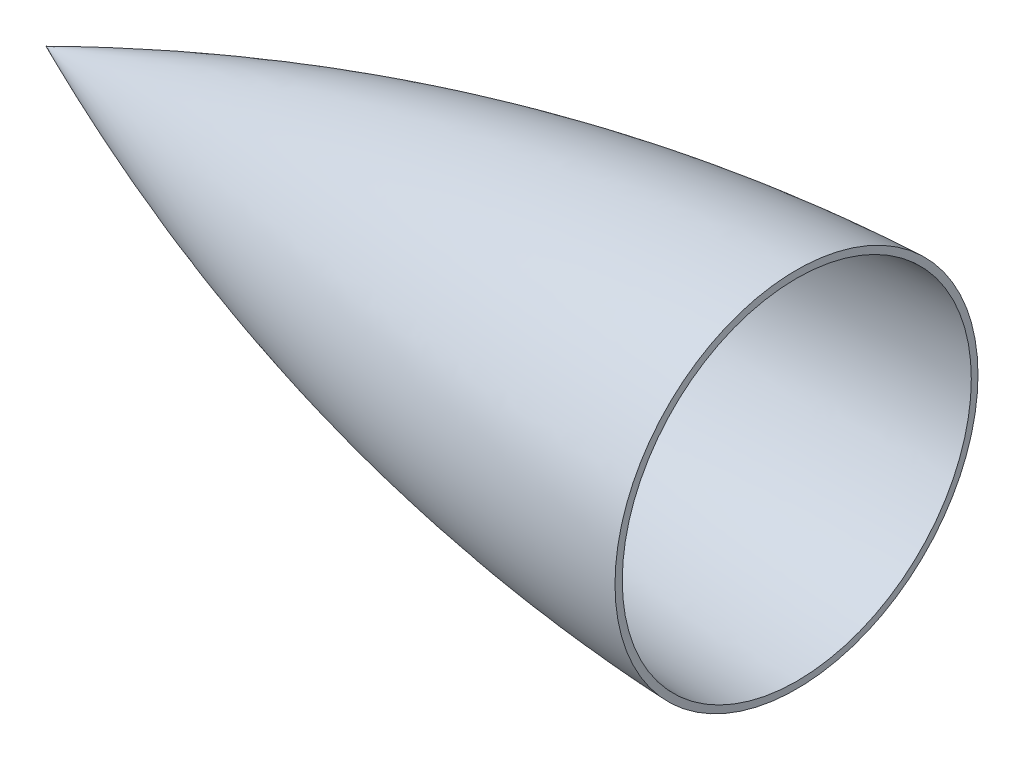
ISO-10303-21;
HEADER;
FILE_DESCRIPTION(('STEP AP214'),'2;1');
FILE_NAME('part.step','',(''),(''),'','','');
FILE_SCHEMA(('AUTOMOTIVE_DESIGN { 1 0 10303 214 1 1 1 1 }'));
ENDSEC;
DATA;
#1=APPLICATION_CONTEXT('core data for automotive mechanical design processes');
#2=APPLICATION_PROTOCOL_DEFINITION('international standard','automotive_design',2000,#1);
#3=PRODUCT_CONTEXT('',#1,'mechanical');
#4=PRODUCT('Part','Part','',(#3));
#5=PRODUCT_RELATED_PRODUCT_CATEGORY('part','',(#4));
#6=PRODUCT_DEFINITION_FORMATION('','',#4);
#7=PRODUCT_DEFINITION_CONTEXT('part definition',#1,'design');
#8=PRODUCT_DEFINITION('design','',#6,#7);
#9=PRODUCT_DEFINITION_SHAPE('','',#8);
#10=(LENGTH_UNIT() NAMED_UNIT(*) SI_UNIT(.MILLI.,.METRE.));
#11=(NAMED_UNIT(*) PLANE_ANGLE_UNIT() SI_UNIT($,.RADIAN.));
#12=(NAMED_UNIT(*) SI_UNIT($,.STERADIAN.) SOLID_ANGLE_UNIT());
#13=UNCERTAINTY_MEASURE_WITH_UNIT(LENGTH_MEASURE(1.E-05),#10,'distance_accuracy_value','');
#14=(GEOMETRIC_REPRESENTATION_CONTEXT(3) GLOBAL_UNCERTAINTY_ASSIGNED_CONTEXT((#13)) GLOBAL_UNIT_ASSIGNED_CONTEXT((#10,
#11,#12)) REPRESENTATION_CONTEXT('',''));
#15=CARTESIAN_POINT('',(0.,0.,0.));
#16=DIRECTION('',(0.,0.,1.));
#17=DIRECTION('',(1.,0.,0.));
#18=AXIS2_PLACEMENT_3D('',#15,#16,#17);
#19=CARTESIAN_POINT('',(95.8975590451523,0.,-25.6217956689713));
#20=CARTESIAN_POINT('',(42.1475590451864,0.,-23.3696706689419));
#21=CARTESIAN_POINT('',(-11.6024409547794,0.,0.377079331060592));
#22=B_SPLINE_CURVE_WITH_KNOTS('',2,(#19,#20,#21),.UNSPECIFIED.,.F.,.F.,(3,3),(0.078934749862079,
0.916266795440852),.UNSPECIFIED.);
#23=CARTESIAN_POINT('',(96.9869119076918,0.,0.377079331054116));
#24=DIRECTION('',(1.,0.,0.));
#25=AXIS1_PLACEMENT('',#23,#24);
#26=SURFACE_OF_REVOLUTION('',#22,#25);
#27=CARTESIAN_POINT('',(-11.6024409547648,0.,0.37707933105413));
#28=VERTEX_POINT('',#27);
#29=VERTEX_LOOP('',#28);
#30=FACE_BOUND('',#29,.T.);
#31=CARTESIAN_POINT('',(95.8975590451783,0.,0.377079331054116));
#32=DIRECTION('',(1.,0.,0.));
#33=DIRECTION('',(0.,0.,-1.));
#34=AXIS2_PLACEMENT_3D('',#31,#32,#33);
#35=CIRCLE('',#34,25.9988750000265);
#36=CARTESIAN_POINT('',(95.8975590451783,0.,-25.6217956689724));
#37=VERTEX_POINT('',#36);
#38=EDGE_CURVE('E11',#37,#37,#35,.T.);
#39=ORIENTED_EDGE('',*,*,#38,.F.);
#40=EDGE_LOOP('',(#39));
#41=FACE_BOUND('',#40,.T.);
#42=ADVANCED_FACE('F34',(#30,#41),#26,.F.);
#43=CARTESIAN_POINT('',(96.9869119076918,0.,0.377079331054116));
#44=DIRECTION('',(-1.,0.,0.));
#45=DIRECTION('',(0.,0.,1.));
#46=AXIS2_PLACEMENT_3D('',#43,#44,#45);
#47=CONICAL_SURFACE('',#46,0.,1.52892082101788);
#48=CARTESIAN_POINT('',(95.9394223134553,0.,0.377079331054116));
#49=DIRECTION('',(1.,0.,0.));
#50=DIRECTION('',(0.,0.,-1.));
#51=AXIS2_PLACEMENT_3D('',#48,#49,#50);
#52=CIRCLE('',#51,24.9997516509003);
#53=CARTESIAN_POINT('',(95.9394223134553,0.,-24.6226723198462));
#54=VERTEX_POINT('',#53);
#55=EDGE_CURVE('E41',#54,#54,#52,.T.);
#56=ORIENTED_EDGE('',*,*,#55,.F.);
#57=EDGE_LOOP('',(#56));
#58=FACE_BOUND('',#57,.T.);
#59=ORIENTED_EDGE('',*,*,#38,.T.);
#60=EDGE_LOOP('',(#59));
#61=FACE_BOUND('',#60,.T.);
#62=ADVANCED_FACE('F50',(#58,#61),#47,.T.);
#63=CARTESIAN_POINT('',(95.8975590451523,0.,-25.6217956689713));
#64=CARTESIAN_POINT('',(43.1949697862786,0.,-23.4135571789942));
#65=CARTESIAN_POINT('',(-9.50761947259504,0.,-0.540250604470606));
#66=B_SPLINE_CURVE_WITH_KNOTS('',2,(#63,#64,#65),.UNSPECIFIED.,.F.,.F.,(3,3),(0.078934749862079,
0.899949947470612),.UNSPECIFIED.);
#67=CARTESIAN_POINT('',(96.9869119076918,0.,0.377079331054116));
#68=DIRECTION('',(1.,0.,0.));
#69=AXIS1_PLACEMENT('',#67,#68);
#70=SURFACE_OF_REVOLUTION('',#66,#69);
#71=OFFSET_SURFACE('',#70,1.,.F.);
#72=CARTESIAN_POINT('',(-9.10949161701322,0.,0.377079331054129));
#73=VERTEX_POINT('',#72);
#74=VERTEX_LOOP('',#73);
#75=FACE_BOUND('',#74,.T.);
#76=ORIENTED_EDGE('',*,*,#55,.T.);
#77=EDGE_LOOP('',(#76));
#78=FACE_BOUND('',#77,.T.);
#79=ADVANCED_FACE('F47',(#75,#78),#71,.T.);
#80=CLOSED_SHELL('',(#42,#62,#79));
#81=MANIFOLD_SOLID_BREP('B2',#80);
#82=ADVANCED_BREP_SHAPE_REPRESENTATION('',(#18,#81),#14);
#83=SHAPE_DEFINITION_REPRESENTATION(#9,#82);
ENDSEC;
END-ISO-10303-21;
